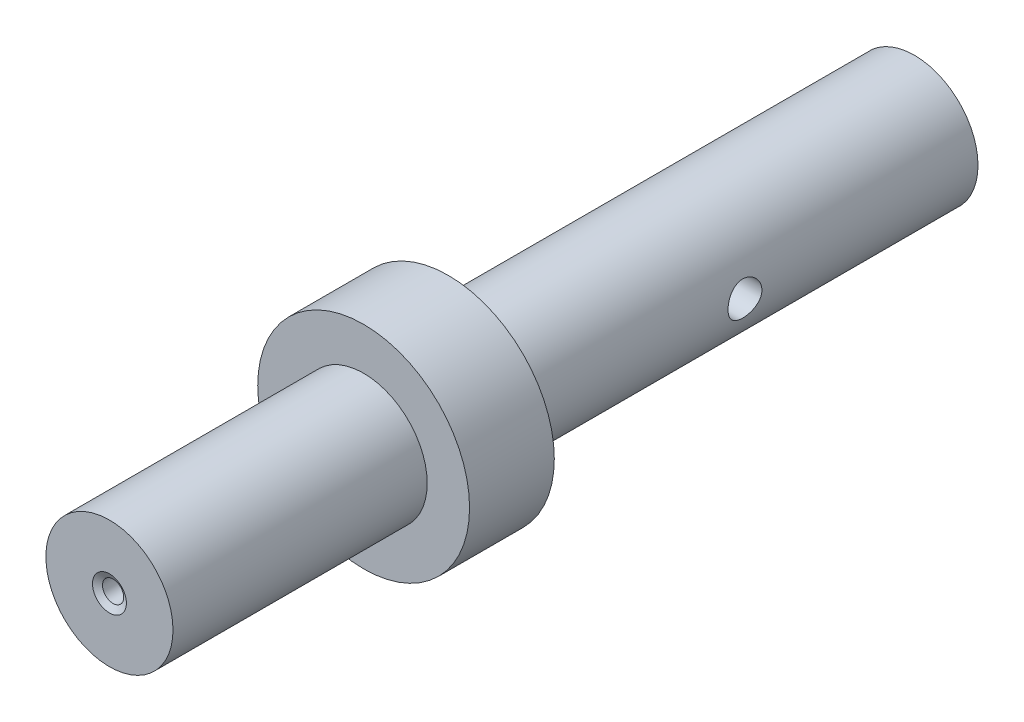
ISO-10303-21;
HEADER;
FILE_DESCRIPTION(('STEP AP214'),'2;1');
FILE_NAME('part.step','',(''),(''),'','','');
FILE_SCHEMA(('AUTOMOTIVE_DESIGN { 1 0 10303 214 1 1 1 1 }'));
ENDSEC;
DATA;
#1=APPLICATION_CONTEXT('core data for automotive mechanical design processes');
#2=APPLICATION_PROTOCOL_DEFINITION('international standard','automotive_design',2000,#1);
#3=PRODUCT_CONTEXT('',#1,'mechanical');
#4=PRODUCT('Part','Part','',(#3));
#5=PRODUCT_RELATED_PRODUCT_CATEGORY('part','',(#4));
#6=PRODUCT_DEFINITION_FORMATION('','',#4);
#7=PRODUCT_DEFINITION_CONTEXT('part definition',#1,'design');
#8=PRODUCT_DEFINITION('design','',#6,#7);
#9=PRODUCT_DEFINITION_SHAPE('','',#8);
#10=(LENGTH_UNIT() NAMED_UNIT(*) SI_UNIT(.MILLI.,.METRE.));
#11=(NAMED_UNIT(*) PLANE_ANGLE_UNIT() SI_UNIT($,.RADIAN.));
#12=(NAMED_UNIT(*) SI_UNIT($,.STERADIAN.) SOLID_ANGLE_UNIT());
#13=UNCERTAINTY_MEASURE_WITH_UNIT(LENGTH_MEASURE(1.E-05),#10,'distance_accuracy_value','');
#14=(GEOMETRIC_REPRESENTATION_CONTEXT(3) GLOBAL_UNCERTAINTY_ASSIGNED_CONTEXT((#13)) GLOBAL_UNIT_ASSIGNED_CONTEXT((#10,
#11,#12)) REPRESENTATION_CONTEXT('',''));
#15=CARTESIAN_POINT('',(0.,0.,0.));
#16=DIRECTION('',(0.,0.,1.));
#17=DIRECTION('',(1.,0.,0.));
#18=AXIS2_PLACEMENT_3D('',#15,#16,#17);
#19=CARTESIAN_POINT('',(0.,0.,10.));
#20=DIRECTION('',(0.,0.,-1.));
#21=DIRECTION('',(-1.,0.,0.));
#22=AXIS2_PLACEMENT_3D('',#19,#20,#21);
#23=CYLINDRICAL_SURFACE('',#22,12.5);
#24=CARTESIAN_POINT('',(0.,0.,10.));
#25=DIRECTION('',(0.,0.,1.));
#26=DIRECTION('',(1.,0.,0.));
#27=AXIS2_PLACEMENT_3D('',#24,#25,#26);
#28=CIRCLE('',#27,12.5);
#29=CARTESIAN_POINT('',(12.5,0.,10.));
#30=VERTEX_POINT('',#29);
#31=EDGE_CURVE('E98',#30,#30,#28,.T.);
#32=ORIENTED_EDGE('',*,*,#31,.F.);
#33=EDGE_LOOP('',(#32));
#34=FACE_BOUND('',#33,.T.);
#35=CARTESIAN_POINT('',(0.,0.,0.));
#36=DIRECTION('',(0.,0.,1.));
#37=DIRECTION('',(1.,0.,0.));
#38=AXIS2_PLACEMENT_3D('',#35,#36,#37);
#39=CIRCLE('',#38,12.5);
#40=CARTESIAN_POINT('',(12.5,0.,0.));
#41=VERTEX_POINT('',#40);
#42=EDGE_CURVE('E97',#41,#41,#39,.T.);
#43=ORIENTED_EDGE('',*,*,#42,.T.);
#44=EDGE_LOOP('',(#43));
#45=FACE_BOUND('',#44,.T.);
#46=ADVANCED_FACE('F50',(#34,#45),#23,.T.);
#47=CARTESIAN_POINT('',(0.,0.,10.));
#48=DIRECTION('',(0.,0.,1.));
#49=DIRECTION('',(1.,0.,0.));
#50=AXIS2_PLACEMENT_3D('',#47,#48,#49);
#51=PLANE('',#50);
#52=CARTESIAN_POINT('',(0.,0.,10.));
#53=DIRECTION('',(0.,0.,1.));
#54=DIRECTION('',(1.,0.,0.));
#55=AXIS2_PLACEMENT_3D('',#52,#53,#54);
#56=CIRCLE('',#55,7.5);
#57=CARTESIAN_POINT('',(7.5,0.,10.));
#58=VERTEX_POINT('',#57);
#59=EDGE_CURVE('E93',#58,#58,#56,.F.);
#60=ORIENTED_EDGE('',*,*,#59,.T.);
#61=EDGE_LOOP('',(#60));
#62=FACE_BOUND('',#61,.T.);
#63=ORIENTED_EDGE('',*,*,#31,.T.);
#64=EDGE_LOOP('',(#63));
#65=FACE_BOUND('',#64,.T.);
#66=ADVANCED_FACE('F134',(#62,#65),#51,.T.);
#67=CARTESIAN_POINT('',(0.,0.,0.));
#68=DIRECTION('',(0.,0.,1.));
#69=DIRECTION('',(1.,0.,0.));
#70=AXIS2_PLACEMENT_3D('',#67,#68,#69);
#71=PLANE('',#70);
#72=CARTESIAN_POINT('',(0.,0.,0.));
#73=DIRECTION('',(0.,0.,1.));
#74=DIRECTION('',(1.,0.,0.));
#75=AXIS2_PLACEMENT_3D('',#72,#73,#74);
#76=CIRCLE('',#75,7.5);
#77=CARTESIAN_POINT('',(7.5,0.,0.));
#78=VERTEX_POINT('',#77);
#79=EDGE_CURVE('E63',#78,#78,#76,.F.);
#80=ORIENTED_EDGE('',*,*,#79,.F.);
#81=EDGE_LOOP('',(#80));
#82=FACE_BOUND('',#81,.T.);
#83=ORIENTED_EDGE('',*,*,#42,.F.);
#84=EDGE_LOOP('',(#83));
#85=FACE_BOUND('',#84,.T.);
#86=ADVANCED_FACE('F139',(#82,#85),#71,.F.);
#87=CARTESIAN_POINT('',(0.,0.,40.));
#88=DIRECTION('',(0.,0.,-1.));
#89=DIRECTION('',(-1.,0.,0.));
#90=AXIS2_PLACEMENT_3D('',#87,#88,#89);
#91=CYLINDRICAL_SURFACE('',#90,7.5);
#92=ORIENTED_EDGE('',*,*,#59,.F.);
#93=EDGE_LOOP('',(#92));
#94=FACE_BOUND('',#93,.T.);
#95=CARTESIAN_POINT('',(0.,0.,40.));
#96=DIRECTION('',(0.,0.,1.));
#97=DIRECTION('',(1.,0.,0.));
#98=AXIS2_PLACEMENT_3D('',#95,#96,#97);
#99=CIRCLE('',#98,7.5);
#100=CARTESIAN_POINT('',(7.5,0.,40.));
#101=VERTEX_POINT('',#100);
#102=EDGE_CURVE('E83',#101,#101,#99,.T.);
#103=ORIENTED_EDGE('',*,*,#102,.F.);
#104=EDGE_LOOP('',(#103));
#105=FACE_BOUND('',#104,.T.);
#106=ADVANCED_FACE('F147',(#94,#105),#91,.T.);
#107=CARTESIAN_POINT('',(0.,0.,40.));
#108=DIRECTION('',(0.,0.,1.));
#109=DIRECTION('',(1.,0.,0.));
#110=AXIS2_PLACEMENT_3D('',#107,#108,#109);
#111=PLANE('',#110);
#112=CARTESIAN_POINT('',(0.,0.,40.));
#113=DIRECTION('',(0.,0.,1.));
#114=DIRECTION('',(1.,0.,0.));
#115=AXIS2_PLACEMENT_3D('',#112,#113,#114);
#116=CIRCLE('',#115,2.);
#117=CARTESIAN_POINT('',(2.,0.,40.));
#118=VERTEX_POINT('',#117);
#119=EDGE_CURVE('E86',#118,#118,#116,.T.);
#120=ORIENTED_EDGE('',*,*,#119,.F.);
#121=EDGE_LOOP('',(#120));
#122=FACE_BOUND('',#121,.T.);
#123=ORIENTED_EDGE('',*,*,#102,.T.);
#124=EDGE_LOOP('',(#123));
#125=FACE_BOUND('',#124,.T.);
#126=ADVANCED_FACE('F131',(#122,#125),#111,.T.);
#127=CARTESIAN_POINT('',(0.,0.,-55.));
#128=DIRECTION('',(0.,0.,1.));
#129=DIRECTION('',(1.,0.,0.));
#130=AXIS2_PLACEMENT_3D('',#127,#128,#129);
#131=CYLINDRICAL_SURFACE('',#130,7.5);
#132=CARTESIAN_POINT('',(-7.5,0.,-29.5));
#133=CARTESIAN_POINT('',(-7.49999833810161,0.110254555832854,-29.4999973830651));
#134=CARTESIAN_POINT('',(-7.49754486162151,0.22053716022184,-29.4908523858103));
#135=CARTESIAN_POINT('',(-7.48799573621659,0.437925451354463,-29.4545787692613));
#136=CARTESIAN_POINT('',(-7.48089785332586,0.545029583319086,-29.4274414955739));
#137=CARTESIAN_POINT('',(-7.4628433325279,0.752891589045311,-29.356128333136));
#138=CARTESIAN_POINT('',(-7.45189167130375,0.853657451015283,-29.311974412334));
#139=CARTESIAN_POINT('',(-7.42728699151678,1.04635368639266,-29.2079627573334));
#140=CARTESIAN_POINT('',(-7.4136337929518,1.13828347044962,-29.1481039766407));
#141=CARTESIAN_POINT('',(-7.38474614901995,1.31282950374001,-29.0129164835866));
#142=CARTESIAN_POINT('',(-7.36948467678681,1.39521168986278,-28.9372913319917));
#143=CARTESIAN_POINT('',(-7.33927409679591,1.54628713660637,-28.7733515169366));
#144=CARTESIAN_POINT('',(-7.32432502947243,1.61497863495664,-28.6850352223825));
#145=CARTESIAN_POINT('',(-7.29615537464372,1.73786409243415,-28.4963517651746));
#146=CARTESIAN_POINT('',(-7.28296888563239,1.79178877736487,-28.3958036717383));
#147=CARTESIAN_POINT('',(-7.26021477318187,1.88187548076994,-28.1866598889076));
#148=CARTESIAN_POINT('',(-7.25064648253265,1.91804077451369,-28.0780656876686));
#149=CARTESIAN_POINT('',(-7.23649115802399,1.97076920226504,-27.858504462175));
#150=CARTESIAN_POINT('',(-7.2317964781149,1.98775670244692,-27.7476464600693));
#151=CARTESIAN_POINT('',(-7.22759830916371,2.0029703470582,-27.5245623166935));
#152=CARTESIAN_POINT('',(-7.22809385014446,2.00119999705753,-27.4123364349759));
#153=CARTESIAN_POINT('',(-7.23412378802031,1.97928510002699,-27.1930145846259));
#154=CARTESIAN_POINT('',(-7.23951735511531,1.95965406064765,-27.0858628179615));
#155=CARTESIAN_POINT('',(-7.25451013080688,1.90339748722183,-26.8764316655438));
#156=CARTESIAN_POINT('',(-7.26410967552612,1.86677059492995,-26.7741526699247));
#157=CARTESIAN_POINT('',(-7.28655661748386,1.77714356965256,-26.5760318561914));
#158=CARTESIAN_POINT('',(-7.29943942818703,1.72396341137784,-26.4802756607137));
#159=CARTESIAN_POINT('',(-7.32698229642445,1.60286503823778,-26.2988658411485));
#160=CARTESIAN_POINT('',(-7.34164270355186,1.53494392224252,-26.2132142108435));
#161=CARTESIAN_POINT('',(-7.37167510629864,1.38366607263419,-26.0515110025452));
#162=CARTESIAN_POINT('',(-7.38705471488831,1.29987812728299,-25.9758636816851));
#163=CARTESIAN_POINT('',(-7.41636381276316,1.12061766820637,-25.8396112196497));
#164=CARTESIAN_POINT('',(-7.43029324488555,1.02514469420509,-25.7790066712976));
#165=CARTESIAN_POINT('',(-7.45521820398293,0.824598255497451,-25.6743820971754));
#166=CARTESIAN_POINT('',(-7.4662007283356,0.719484902551789,-25.6304352295514));
#167=CARTESIAN_POINT('',(-7.48390044400999,0.503002294390396,-25.5609528111866));
#168=CARTESIAN_POINT('',(-7.49061856733749,0.391634411928324,-25.535413237276));
#169=CARTESIAN_POINT('',(-7.49889158558384,0.169254083145517,-25.5041051230822));
#170=CARTESIAN_POINT('',(-7.50058997470959,0.0583242376413817,-25.4977869601491));
#171=CARTESIAN_POINT('',(-7.49904471691695,-0.163010045901197,-25.5035831642469));
#172=CARTESIAN_POINT('',(-7.49580158080353,-0.273414537062113,-25.5156956261058));
#173=CARTESIAN_POINT('',(-7.48483035496021,-0.488602449901779,-25.55755844746));
#174=CARTESIAN_POINT('',(-7.4771802654633,-0.593449852027781,-25.5870022461978));
#175=CARTESIAN_POINT('',(-7.45826294894139,-0.796706971176063,-25.6623359445079));
#176=CARTESIAN_POINT('',(-7.44699532996161,-0.895115989216026,-25.7082276262505));
#177=CARTESIAN_POINT('',(-7.42175660559528,-1.08483847466795,-25.8161738871805));
#178=CARTESIAN_POINT('',(-7.40773686604957,-1.17597518846118,-25.8785274667977));
#179=CARTESIAN_POINT('',(-7.37861452365564,-1.34668463539714,-26.017251630158));
#180=CARTESIAN_POINT('',(-7.3635117072752,-1.42625507879918,-26.0936249826011));
#181=CARTESIAN_POINT('',(-7.33339745866705,-1.57388924478774,-26.2607855774946));
#182=CARTESIAN_POINT('',(-7.31840061429312,-1.64156519249816,-26.3519185613952));
#183=CARTESIAN_POINT('',(-7.29066447182727,-1.76067191185118,-26.5445646960996));
#184=CARTESIAN_POINT('',(-7.27792507956316,-1.81210336122161,-26.6460774136223));
#185=CARTESIAN_POINT('',(-7.2562926837321,-1.89687411586112,-26.8560953070761));
#186=CARTESIAN_POINT('',(-7.24737748318009,-1.93031812253957,-26.9645558118176));
#187=CARTESIAN_POINT('',(-7.23439825126801,-1.97841205118791,-27.1858393196748));
#188=CARTESIAN_POINT('',(-7.23033298020014,-1.99306677602478,-27.2986612003479));
#189=CARTESIAN_POINT('',(-7.22761744573589,-2.00288989653714,-27.5214947878838));
#190=CARTESIAN_POINT('',(-7.22879397743239,-1.99868155618109,-27.6314773202583));
#191=CARTESIAN_POINT('',(-7.23602396081087,-1.97234376000439,-27.84910351401));
#192=CARTESIAN_POINT('',(-7.24207728699439,-1.95021476535025,-27.9567472355006));
#193=CARTESIAN_POINT('',(-7.25827571073158,-1.88902515699699,-28.1658557521298));
#194=CARTESIAN_POINT('',(-7.26838885019644,-1.8500966107558,-28.2673618427322));
#195=CARTESIAN_POINT('',(-7.29156818136177,-1.75651554562386,-28.4624788305341));
#196=CARTESIAN_POINT('',(-7.30463483621364,-1.70186056024616,-28.5560884863005));
#197=CARTESIAN_POINT('',(-7.3327292144046,-1.57648909268817,-28.7357303594966));
#198=CARTESIAN_POINT('',(-7.3478033310169,-1.50534729767909,-28.8214585349762));
#199=CARTESIAN_POINT('',(-7.37795503783007,-1.349830535111,-28.9799624516673));
#200=CARTESIAN_POINT('',(-7.39303262798441,-1.26545235435875,-29.0527350386688));
#201=CARTESIAN_POINT('',(-7.42187812403968,-1.08367998108869,-29.1847922376469));
#202=CARTESIAN_POINT('',(-7.43561111314551,-0.98604596175178,-29.2437550106493));
#203=CARTESIAN_POINT('',(-7.45983810102897,-0.78188864041689,-29.3443374159294));
#204=CARTESIAN_POINT('',(-7.47033417683594,-0.675371094696297,-29.3859681756636));
#205=CARTESIAN_POINT('',(-7.48554752513468,-0.47437470488099,-29.4452752854155));
#206=CARTESIAN_POINT('',(-7.49092770592602,-0.380762016565036,-29.4657493835925));
#207=CARTESIAN_POINT('',(-7.49815449036456,-0.191439795317076,-29.4931122061671));
#208=CARTESIAN_POINT('',(-7.5000014429727,-0.0957304704048601,-29.5000022722));
#209=CARTESIAN_POINT('',(-7.5,0.,-29.5));
#210=B_SPLINE_CURVE_WITH_KNOTS('',3,(#132,#133,#134,#135,#136,#137,#138,#139,#140,#141,#142,
#143,#144,#145,#146,#147,#148,#149,#150,#151,#152,#153,#154,#155,#156,#157,#158,#159,#160,#161,
#162,#163,#164,#165,#166,#167,#168,#169,#170,#171,#172,#173,#174,#175,#176,#177,#178,#179,#180,
#181,#182,#183,#184,#185,#186,#187,#188,#189,#190,#191,#192,#193,#194,#195,#196,#197,#198,#199,
#200,#201,#202,#203,#204,#205,#206,#207,#208,#209),.UNSPECIFIED.,.T.,.F.,(4,2,2,2,2,2,2,2,2,2,2,
2,2,2,2,2,2,2,2,2,2,2,2,2,2,2,2,2,2,2,2,2,2,2,2,2,2,2,4),(0.,0.330412598949569,
0.660984243761449,0.991130552971931,1.32129886708675,1.65834897954966,1.99544244925149,
2.33832582523229,2.681145941297,3.01622158250468,3.3512346040432,3.67691002045996,
4.00261146812939,4.33198673346497,4.66142688117629,5.00161259812322,5.34181171937597,
5.68348809603041,6.02508977190138,6.35682717524546,6.6885302892535,7.01453535642115,
7.34057575775614,7.6730028600455,8.00549568258886,8.34736496382788,8.68921998024107,
9.02906297699386,9.36881908663982,9.69743342403611,10.0260393052059,10.352107654483,
10.67822717123,11.0139433957139,11.3497412433245,11.692722522809,12.0354832614518,
12.3223981899334,12.6092847796638),.UNSPECIFIED.);
#211=CARTESIAN_POINT('',(-7.5,0.,-29.5));
#212=VERTEX_POINT('',#211);
#213=EDGE_CURVE('E53',#212,#212,#210,.T.);
#214=ORIENTED_EDGE('',*,*,#213,.T.);
#215=EDGE_LOOP('',(#214));
#216=FACE_BOUND('',#215,.T.);
#217=CARTESIAN_POINT('',(7.5,0.,-29.5));
#218=CARTESIAN_POINT('',(7.49999833810161,-0.110254555832854,-29.4999973830651));
#219=CARTESIAN_POINT('',(7.49754486162151,-0.22053716022184,-29.4908523858103));
#220=CARTESIAN_POINT('',(7.48799573621659,-0.437925451354463,-29.4545787692613));
#221=CARTESIAN_POINT('',(7.48089785332586,-0.545029583319086,-29.4274414955739));
#222=CARTESIAN_POINT('',(7.4628433325279,-0.752891589045311,-29.356128333136));
#223=CARTESIAN_POINT('',(7.45189167130375,-0.853657451015283,-29.311974412334));
#224=CARTESIAN_POINT('',(7.42728699151678,-1.04635368639266,-29.2079627573334));
#225=CARTESIAN_POINT('',(7.4136337929518,-1.13828347044962,-29.1481039766407));
#226=CARTESIAN_POINT('',(7.38474614901995,-1.31282950374001,-29.0129164835866));
#227=CARTESIAN_POINT('',(7.36948467678681,-1.39521168986278,-28.9372913319917));
#228=CARTESIAN_POINT('',(7.33927409679591,-1.54628713660637,-28.7733515169366));
#229=CARTESIAN_POINT('',(7.32432502947243,-1.61497863495664,-28.6850352223825));
#230=CARTESIAN_POINT('',(7.29615537464372,-1.73786409243415,-28.4963517651746));
#231=CARTESIAN_POINT('',(7.28296888563239,-1.79178877736487,-28.3958036717383));
#232=CARTESIAN_POINT('',(7.26021477318187,-1.88187548076994,-28.1866598889076));
#233=CARTESIAN_POINT('',(7.25064648253265,-1.91804077451369,-28.0780656876686));
#234=CARTESIAN_POINT('',(7.23649115802399,-1.97076920226504,-27.858504462175));
#235=CARTESIAN_POINT('',(7.2317964781149,-1.98775670244692,-27.7476464600693));
#236=CARTESIAN_POINT('',(7.22759830916371,-2.0029703470582,-27.5245623166935));
#237=CARTESIAN_POINT('',(7.22809385014446,-2.00119999705753,-27.4123364349759));
#238=CARTESIAN_POINT('',(7.23412378802031,-1.97928510002699,-27.1930145846259));
#239=CARTESIAN_POINT('',(7.23951735511531,-1.95965406064765,-27.0858628179615));
#240=CARTESIAN_POINT('',(7.25451013080688,-1.90339748722183,-26.8764316655438));
#241=CARTESIAN_POINT('',(7.26410967552612,-1.86677059492995,-26.7741526699247));
#242=CARTESIAN_POINT('',(7.28655661748386,-1.77714356965256,-26.5760318561914));
#243=CARTESIAN_POINT('',(7.29943942818703,-1.72396341137784,-26.4802756607137));
#244=CARTESIAN_POINT('',(7.32698229642445,-1.60286503823778,-26.2988658411485));
#245=CARTESIAN_POINT('',(7.34164270355186,-1.53494392224252,-26.2132142108435));
#246=CARTESIAN_POINT('',(7.37167510629864,-1.38366607263419,-26.0515110025452));
#247=CARTESIAN_POINT('',(7.38705471488831,-1.29987812728299,-25.9758636816851));
#248=CARTESIAN_POINT('',(7.41636381276316,-1.12061766820637,-25.8396112196497));
#249=CARTESIAN_POINT('',(7.43029324488555,-1.02514469420509,-25.7790066712976));
#250=CARTESIAN_POINT('',(7.45521820398293,-0.824598255497451,-25.6743820971754));
#251=CARTESIAN_POINT('',(7.4662007283356,-0.719484902551789,-25.6304352295514));
#252=CARTESIAN_POINT('',(7.48390044400999,-0.503002294390396,-25.5609528111866));
#253=CARTESIAN_POINT('',(7.49061856733749,-0.391634411928324,-25.535413237276));
#254=CARTESIAN_POINT('',(7.49889158558384,-0.169254083145517,-25.5041051230822));
#255=CARTESIAN_POINT('',(7.50058997470959,-0.0583242376413817,-25.4977869601491));
#256=CARTESIAN_POINT('',(7.49904471691695,0.163010045901197,-25.5035831642469));
#257=CARTESIAN_POINT('',(7.49580158080353,0.273414537062113,-25.5156956261058));
#258=CARTESIAN_POINT('',(7.48483035496021,0.488602449901779,-25.55755844746));
#259=CARTESIAN_POINT('',(7.4771802654633,0.593449852027781,-25.5870022461978));
#260=CARTESIAN_POINT('',(7.45826294894139,0.796706971176063,-25.6623359445079));
#261=CARTESIAN_POINT('',(7.44699532996161,0.895115989216026,-25.7082276262505));
#262=CARTESIAN_POINT('',(7.42175660559528,1.08483847466795,-25.8161738871805));
#263=CARTESIAN_POINT('',(7.40773686604957,1.17597518846118,-25.8785274667977));
#264=CARTESIAN_POINT('',(7.37861452365564,1.34668463539714,-26.017251630158));
#265=CARTESIAN_POINT('',(7.3635117072752,1.42625507879918,-26.0936249826011));
#266=CARTESIAN_POINT('',(7.33339745866705,1.57388924478774,-26.2607855774946));
#267=CARTESIAN_POINT('',(7.31840061429312,1.64156519249816,-26.3519185613952));
#268=CARTESIAN_POINT('',(7.29066447182727,1.76067191185118,-26.5445646960996));
#269=CARTESIAN_POINT('',(7.27792507956316,1.81210336122161,-26.6460774136223));
#270=CARTESIAN_POINT('',(7.2562926837321,1.89687411586112,-26.8560953070761));
#271=CARTESIAN_POINT('',(7.24737748318009,1.93031812253957,-26.9645558118176));
#272=CARTESIAN_POINT('',(7.23439825126801,1.97841205118791,-27.1858393196748));
#273=CARTESIAN_POINT('',(7.23033298020014,1.99306677602478,-27.2986612003479));
#274=CARTESIAN_POINT('',(7.22761744573589,2.00288989653714,-27.5214947878838));
#275=CARTESIAN_POINT('',(7.22879397743239,1.99868155618109,-27.6314773202583));
#276=CARTESIAN_POINT('',(7.23602396081087,1.97234376000439,-27.84910351401));
#277=CARTESIAN_POINT('',(7.24207728699439,1.95021476535025,-27.9567472355006));
#278=CARTESIAN_POINT('',(7.25827571073158,1.88902515699699,-28.1658557521298));
#279=CARTESIAN_POINT('',(7.26838885019644,1.8500966107558,-28.2673618427322));
#280=CARTESIAN_POINT('',(7.29156818136177,1.75651554562386,-28.4624788305341));
#281=CARTESIAN_POINT('',(7.30463483621364,1.70186056024616,-28.5560884863005));
#282=CARTESIAN_POINT('',(7.3327292144046,1.57648909268817,-28.7357303594966));
#283=CARTESIAN_POINT('',(7.3478033310169,1.50534729767909,-28.8214585349762));
#284=CARTESIAN_POINT('',(7.37795503783007,1.349830535111,-28.9799624516673));
#285=CARTESIAN_POINT('',(7.39303262798441,1.26545235435875,-29.0527350386688));
#286=CARTESIAN_POINT('',(7.42187812403968,1.08367998108869,-29.1847922376469));
#287=CARTESIAN_POINT('',(7.43561111314551,0.98604596175178,-29.2437550106493));
#288=CARTESIAN_POINT('',(7.45983810102897,0.78188864041689,-29.3443374159294));
#289=CARTESIAN_POINT('',(7.47033417683594,0.675371094696297,-29.3859681756636));
#290=CARTESIAN_POINT('',(7.48554752513468,0.47437470488099,-29.4452752854155));
#291=CARTESIAN_POINT('',(7.49092770592602,0.380762016565036,-29.4657493835925));
#292=CARTESIAN_POINT('',(7.49815449036456,0.191439795317076,-29.4931122061671));
#293=CARTESIAN_POINT('',(7.5000014429727,0.0957304704048601,-29.5000022722));
#294=CARTESIAN_POINT('',(7.5,0.,-29.5));
#295=B_SPLINE_CURVE_WITH_KNOTS('',3,(#217,#218,#219,#220,#221,#222,#223,#224,#225,#226,#227,
#228,#229,#230,#231,#232,#233,#234,#235,#236,#237,#238,#239,#240,#241,#242,#243,#244,#245,#246,
#247,#248,#249,#250,#251,#252,#253,#254,#255,#256,#257,#258,#259,#260,#261,#262,#263,#264,#265,
#266,#267,#268,#269,#270,#271,#272,#273,#274,#275,#276,#277,#278,#279,#280,#281,#282,#283,#284,
#285,#286,#287,#288,#289,#290,#291,#292,#293,#294),.UNSPECIFIED.,.T.,.F.,(4,2,2,2,2,2,2,2,2,2,2,
2,2,2,2,2,2,2,2,2,2,2,2,2,2,2,2,2,2,2,2,2,2,2,2,2,2,2,4),(0.,0.330412598949569,
0.660984243761449,0.991130552971931,1.32129886708675,1.65834897954966,1.99544244925149,
2.33832582523229,2.681145941297,3.01622158250468,3.3512346040432,3.67691002045996,
4.00261146812939,4.33198673346497,4.66142688117629,5.00161259812322,5.34181171937597,
5.68348809603041,6.02508977190138,6.35682717524546,6.6885302892535,7.01453535642115,
7.34057575775614,7.6730028600455,8.00549568258886,8.34736496382788,8.68921998024107,
9.02906297699386,9.36881908663982,9.69743342403611,10.0260393052059,10.352107654483,
10.67822717123,11.0139433957139,11.3497412433245,11.692722522809,12.0354832614518,
12.3223981899334,12.6092847796638),.UNSPECIFIED.);
#296=CARTESIAN_POINT('',(7.5,0.,-29.5));
#297=VERTEX_POINT('',#296);
#298=EDGE_CURVE('E11',#297,#297,#295,.T.);
#299=ORIENTED_EDGE('',*,*,#298,.T.);
#300=EDGE_LOOP('',(#299));
#301=FACE_BOUND('',#300,.T.);
#302=CARTESIAN_POINT('',(0.,0.,-55.));
#303=DIRECTION('',(0.,0.,-1.));
#304=DIRECTION('',(-1.,0.,0.));
#305=AXIS2_PLACEMENT_3D('',#302,#303,#304);
#306=CIRCLE('',#305,7.5);
#307=CARTESIAN_POINT('',(-7.5,0.,-55.));
#308=VERTEX_POINT('',#307);
#309=EDGE_CURVE('E77',#308,#308,#306,.T.);
#310=ORIENTED_EDGE('',*,*,#309,.F.);
#311=EDGE_LOOP('',(#310));
#312=FACE_BOUND('',#311,.T.);
#313=ORIENTED_EDGE('',*,*,#79,.T.);
#314=EDGE_LOOP('',(#313));
#315=FACE_BOUND('',#314,.T.);
#316=ADVANCED_FACE('F110',(#216,#301,#312,#315),#131,.T.);
#317=CARTESIAN_POINT('',(0.,0.,-55.));
#318=DIRECTION('',(0.,0.,-1.));
#319=DIRECTION('',(-1.,0.,0.));
#320=AXIS2_PLACEMENT_3D('',#317,#318,#319);
#321=PLANE('',#320);
#322=ORIENTED_EDGE('',*,*,#309,.T.);
#323=EDGE_LOOP('',(#322));
#324=FACE_BOUND('',#323,.T.);
#325=ADVANCED_FACE('F70',(#324),#321,.T.);
#326=CARTESIAN_POINT('',(0.,0.,25.));
#327=DIRECTION('',(0.,0.,1.));
#328=DIRECTION('',(1.,0.,0.));
#329=AXIS2_PLACEMENT_3D('',#326,#327,#328);
#330=CONICAL_SURFACE('',#329,1.24999999999999,1.02974425867665);
#331=CARTESIAN_POINT('',(0.,0.,24.2489242262156));
#332=VERTEX_POINT('',#331);
#333=VERTEX_LOOP('',#332);
#334=FACE_BOUND('',#333,.T.);
#335=CARTESIAN_POINT('',(0.,0.,25.));
#336=DIRECTION('',(0.,0.,1.));
#337=DIRECTION('',(1.,0.,0.));
#338=AXIS2_PLACEMENT_3D('',#335,#336,#337);
#339=CIRCLE('',#338,1.24999999999999);
#340=CARTESIAN_POINT('',(1.24999999999999,0.,25.));
#341=VERTEX_POINT('',#340);
#342=EDGE_CURVE('E74',#341,#341,#339,.T.);
#343=ORIENTED_EDGE('',*,*,#342,.T.);
#344=EDGE_LOOP('',(#343));
#345=FACE_BOUND('',#344,.T.);
#346=ADVANCED_FACE('F66',(#334,#345),#330,.F.);
#347=CARTESIAN_POINT('',(0.,0.,40.));
#348=DIRECTION('',(0.,0.,1.));
#349=DIRECTION('',(1.,0.,0.));
#350=AXIS2_PLACEMENT_3D('',#347,#348,#349);
#351=CYLINDRICAL_SURFACE('',#350,1.24999999999999);
#352=ORIENTED_EDGE('',*,*,#342,.F.);
#353=EDGE_LOOP('',(#352));
#354=FACE_BOUND('',#353,.T.);
#355=CARTESIAN_POINT('',(0.,0.,39.5669872981078));
#356=DIRECTION('',(0.,0.,1.));
#357=DIRECTION('',(1.,0.,0.));
#358=AXIS2_PLACEMENT_3D('',#355,#356,#357);
#359=CIRCLE('',#358,1.25);
#360=CARTESIAN_POINT('',(1.25,0.,39.5669872981078));
#361=VERTEX_POINT('',#360);
#362=EDGE_CURVE('E78',#361,#361,#359,.T.);
#363=ORIENTED_EDGE('',*,*,#362,.T.);
#364=EDGE_LOOP('',(#363));
#365=FACE_BOUND('',#364,.T.);
#366=ADVANCED_FACE('F69',(#354,#365),#351,.F.);
#367=CARTESIAN_POINT('',(0.,0.,40.));
#368=DIRECTION('',(0.,0.,1.));
#369=DIRECTION('',(1.,0.,0.));
#370=AXIS2_PLACEMENT_3D('',#367,#368,#369);
#371=CONICAL_SURFACE('',#370,2.,1.0471975511966);
#372=ORIENTED_EDGE('',*,*,#362,.F.);
#373=EDGE_LOOP('',(#372));
#374=FACE_BOUND('',#373,.T.);
#375=ORIENTED_EDGE('',*,*,#119,.T.);
#376=EDGE_LOOP('',(#375));
#377=FACE_BOUND('',#376,.T.);
#378=ADVANCED_FACE('F118',(#374,#377),#371,.F.);
#379=CARTESIAN_POINT('',(-12.5,0.,-27.5));
#380=DIRECTION('',(1.,0.,0.));
#381=DIRECTION('',(0.,0.,-1.));
#382=AXIS2_PLACEMENT_3D('',#379,#380,#381);
#383=CYLINDRICAL_SURFACE('',#382,2.);
#384=ORIENTED_EDGE('',*,*,#213,.F.);
#385=EDGE_LOOP('',(#384));
#386=FACE_BOUND('',#385,.T.);
#387=ORIENTED_EDGE('',*,*,#298,.F.);
#388=EDGE_LOOP('',(#387));
#389=FACE_BOUND('',#388,.T.);
#390=ADVANCED_FACE('F114',(#386,#389),#383,.F.);
#391=CLOSED_SHELL('',(#46,#66,#86,#106,#126,#316,#325,#346,#366,#378,#390));
#392=MANIFOLD_SOLID_BREP('B2',#391);
#393=ADVANCED_BREP_SHAPE_REPRESENTATION('',(#18,#392),#14);
#394=SHAPE_DEFINITION_REPRESENTATION(#9,#393);
ENDSEC;
END-ISO-10303-21;
